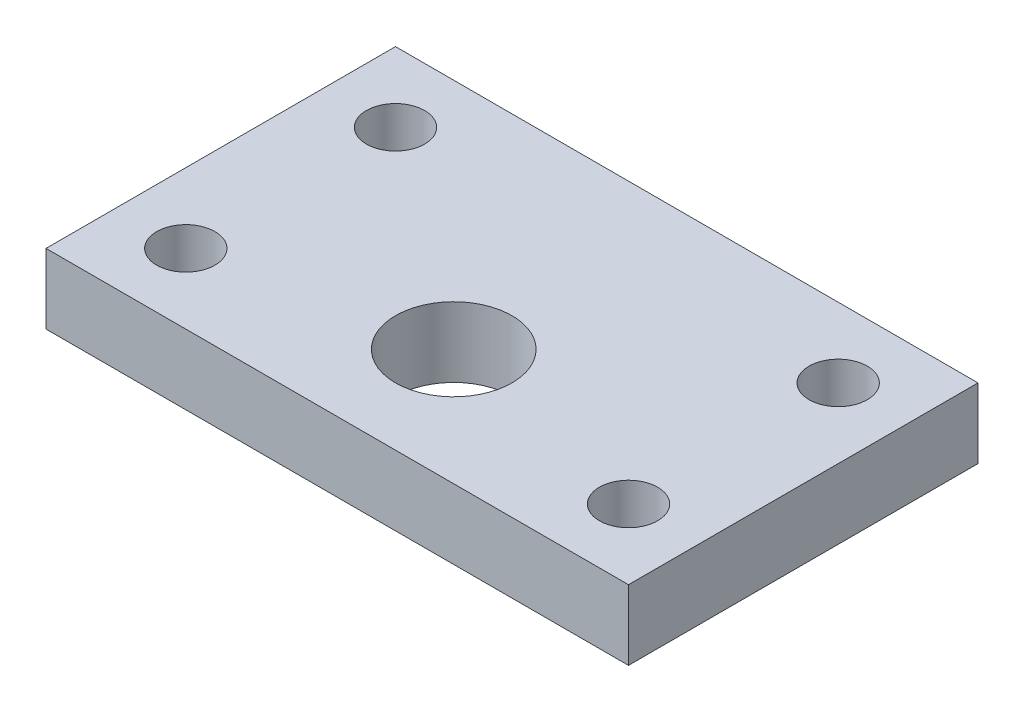
ISO-10303-21;
HEADER;
FILE_DESCRIPTION(('STEP AP214'),'2;1');
FILE_NAME('part.step','',(''),(''),'','','');
FILE_SCHEMA(('AUTOMOTIVE_DESIGN { 1 0 10303 214 1 1 1 1 }'));
ENDSEC;
DATA;
#1=APPLICATION_CONTEXT('core data for automotive mechanical design processes');
#2=APPLICATION_PROTOCOL_DEFINITION('international standard','automotive_design',2000,#1);
#3=PRODUCT_CONTEXT('',#1,'mechanical');
#4=PRODUCT('Part','Part','',(#3));
#5=PRODUCT_RELATED_PRODUCT_CATEGORY('part','',(#4));
#6=PRODUCT_DEFINITION_FORMATION('','',#4);
#7=PRODUCT_DEFINITION_CONTEXT('part definition',#1,'design');
#8=PRODUCT_DEFINITION('design','',#6,#7);
#9=PRODUCT_DEFINITION_SHAPE('','',#8);
#10=(LENGTH_UNIT() NAMED_UNIT(*) SI_UNIT(.MILLI.,.METRE.));
#11=(NAMED_UNIT(*) PLANE_ANGLE_UNIT() SI_UNIT($,.RADIAN.));
#12=(NAMED_UNIT(*) SI_UNIT($,.STERADIAN.) SOLID_ANGLE_UNIT());
#13=UNCERTAINTY_MEASURE_WITH_UNIT(LENGTH_MEASURE(1.E-05),#10,'distance_accuracy_value','');
#14=(GEOMETRIC_REPRESENTATION_CONTEXT(3) GLOBAL_UNCERTAINTY_ASSIGNED_CONTEXT((#13)) GLOBAL_UNIT_ASSIGNED_CONTEXT((#10,
#11,#12)) REPRESENTATION_CONTEXT('',''));
#15=CARTESIAN_POINT('',(0.,0.,0.));
#16=DIRECTION('',(0.,0.,1.));
#17=DIRECTION('',(1.,0.,0.));
#18=AXIS2_PLACEMENT_3D('',#15,#16,#17);
#19=CARTESIAN_POINT('',(0.,30.,0.));
#20=DIRECTION('',(0.,1.,0.));
#21=DIRECTION('',(0.,0.,1.));
#22=AXIS2_PLACEMENT_3D('',#19,#20,#21);
#23=PLANE('',#22);
#24=CARTESIAN_POINT('',(95.,30.,-45.));
#25=DIRECTION('',(0.,1.,0.));
#26=DIRECTION('',(0.,0.,1.));
#27=AXIS2_PLACEMENT_3D('',#24,#25,#26);
#28=CIRCLE('',#27,12.5);
#29=CARTESIAN_POINT('',(95.,30.,-32.5));
#30=VERTEX_POINT('',#29);
#31=EDGE_CURVE('E131',#30,#30,#28,.T.);
#32=ORIENTED_EDGE('',*,*,#31,.F.);
#33=EDGE_LOOP('',(#32));
#34=FACE_BOUND('',#33,.T.);
#35=CARTESIAN_POINT('',(-95.,30.,45.));
#36=DIRECTION('',(0.,1.,0.));
#37=DIRECTION('',(0.,0.,1.));
#38=AXIS2_PLACEMENT_3D('',#35,#36,#37);
#39=CIRCLE('',#38,12.5);
#40=CARTESIAN_POINT('',(-95.,30.,57.5));
#41=VERTEX_POINT('',#40);
#42=EDGE_CURVE('E119',#41,#41,#39,.T.);
#43=ORIENTED_EDGE('',*,*,#42,.F.);
#44=EDGE_LOOP('',(#43));
#45=FACE_BOUND('',#44,.T.);
#46=DIRECTION('',(0.,0.,-1.));
#47=VECTOR('',#46,1.);
#48=CARTESIAN_POINT('',(125.,30.,-75.));
#49=LINE('',#48,#47);
#50=CARTESIAN_POINT('',(125.,30.,75.));
#51=VERTEX_POINT('',#50);
#52=CARTESIAN_POINT('',(125.,30.,-75.));
#53=VERTEX_POINT('',#52);
#54=EDGE_CURVE('E89',#51,#53,#49,.T.);
#55=ORIENTED_EDGE('',*,*,#54,.T.);
#56=DIRECTION('',(-1.,0.,0.));
#57=VECTOR('',#56,1.);
#58=CARTESIAN_POINT('',(-125.,30.,-75.));
#59=LINE('',#58,#57);
#60=CARTESIAN_POINT('',(-125.,30.,-75.));
#61=VERTEX_POINT('',#60);
#62=EDGE_CURVE('E84',#53,#61,#59,.T.);
#63=ORIENTED_EDGE('',*,*,#62,.T.);
#64=DIRECTION('',(0.,0.,1.));
#65=VECTOR('',#64,1.);
#66=CARTESIAN_POINT('',(-125.,30.,-75.));
#67=LINE('',#66,#65);
#68=CARTESIAN_POINT('',(-125.,30.,75.));
#69=VERTEX_POINT('',#68);
#70=EDGE_CURVE('E87',#61,#69,#67,.T.);
#71=ORIENTED_EDGE('',*,*,#70,.T.);
#72=DIRECTION('',(1.,0.,0.));
#73=VECTOR('',#72,1.);
#74=CARTESIAN_POINT('',(-125.,30.,75.));
#75=LINE('',#74,#73);
#76=EDGE_CURVE('E54',#69,#51,#75,.T.);
#77=ORIENTED_EDGE('',*,*,#76,.T.);
#78=EDGE_LOOP('',(#55,#63,#71,#77));
#79=FACE_BOUND('',#78,.T.);
#80=CARTESIAN_POINT('',(0.,30.,25.));
#81=DIRECTION('',(0.,1.,0.));
#82=DIRECTION('',(0.,0.,1.));
#83=AXIS2_PLACEMENT_3D('',#80,#81,#82);
#84=CIRCLE('',#83,25.);
#85=CARTESIAN_POINT('',(0.,30.,50.));
#86=VERTEX_POINT('',#85);
#87=EDGE_CURVE('E104',#86,#86,#84,.T.);
#88=ORIENTED_EDGE('',*,*,#87,.F.);
#89=EDGE_LOOP('',(#88));
#90=FACE_BOUND('',#89,.T.);
#91=CARTESIAN_POINT('',(-95.,30.,-45.));
#92=DIRECTION('',(0.,1.,0.));
#93=DIRECTION('',(0.,0.,1.));
#94=AXIS2_PLACEMENT_3D('',#91,#92,#93);
#95=CIRCLE('',#94,12.5);
#96=CARTESIAN_POINT('',(-95.,30.,-32.5));
#97=VERTEX_POINT('',#96);
#98=EDGE_CURVE('E125',#97,#97,#95,.T.);
#99=ORIENTED_EDGE('',*,*,#98,.F.);
#100=EDGE_LOOP('',(#99));
#101=FACE_BOUND('',#100,.T.);
#102=CARTESIAN_POINT('',(95.,30.,45.));
#103=DIRECTION('',(0.,1.,0.));
#104=DIRECTION('',(0.,0.,1.));
#105=AXIS2_PLACEMENT_3D('',#102,#103,#104);
#106=CIRCLE('',#105,12.5);
#107=CARTESIAN_POINT('',(95.,30.,57.5));
#108=VERTEX_POINT('',#107);
#109=EDGE_CURVE('E137',#108,#108,#106,.T.);
#110=ORIENTED_EDGE('',*,*,#109,.F.);
#111=EDGE_LOOP('',(#110));
#112=FACE_BOUND('',#111,.T.);
#113=ADVANCED_FACE('F37',(#34,#45,#79,#90,#101,#112),#23,.T.);
#114=CARTESIAN_POINT('',(0.,0.,0.));
#115=DIRECTION('',(0.,1.,0.));
#116=DIRECTION('',(0.,0.,1.));
#117=AXIS2_PLACEMENT_3D('',#114,#115,#116);
#118=PLANE('',#117);
#119=DIRECTION('',(0.,0.,-1.));
#120=VECTOR('',#119,1.);
#121=CARTESIAN_POINT('',(125.,0.,-75.));
#122=LINE('',#121,#120);
#123=CARTESIAN_POINT('',(125.,0.,75.));
#124=VERTEX_POINT('',#123);
#125=CARTESIAN_POINT('',(125.,0.,-75.));
#126=VERTEX_POINT('',#125);
#127=EDGE_CURVE('E101',#124,#126,#122,.T.);
#128=ORIENTED_EDGE('',*,*,#127,.F.);
#129=DIRECTION('',(1.,0.,0.));
#130=VECTOR('',#129,1.);
#131=CARTESIAN_POINT('',(-125.,0.,75.));
#132=LINE('',#131,#130);
#133=CARTESIAN_POINT('',(-125.,0.,75.));
#134=VERTEX_POINT('',#133);
#135=EDGE_CURVE('E77',#134,#124,#132,.T.);
#136=ORIENTED_EDGE('',*,*,#135,.F.);
#137=DIRECTION('',(0.,0.,1.));
#138=VECTOR('',#137,1.);
#139=CARTESIAN_POINT('',(-125.,0.,-75.));
#140=LINE('',#139,#138);
#141=CARTESIAN_POINT('',(-125.,0.,-75.));
#142=VERTEX_POINT('',#141);
#143=EDGE_CURVE('E71',#142,#134,#140,.T.);
#144=ORIENTED_EDGE('',*,*,#143,.F.);
#145=DIRECTION('',(-1.,0.,0.));
#146=VECTOR('',#145,1.);
#147=CARTESIAN_POINT('',(-125.,0.,-75.));
#148=LINE('',#147,#146);
#149=EDGE_CURVE('E93',#126,#142,#148,.T.);
#150=ORIENTED_EDGE('',*,*,#149,.F.);
#151=EDGE_LOOP('',(#128,#136,#144,#150));
#152=FACE_BOUND('',#151,.T.);
#153=CARTESIAN_POINT('',(0.,0.,25.));
#154=DIRECTION('',(0.,1.,0.));
#155=DIRECTION('',(0.,0.,1.));
#156=AXIS2_PLACEMENT_3D('',#153,#154,#155);
#157=CIRCLE('',#156,25.);
#158=CARTESIAN_POINT('',(0.,0.,50.));
#159=VERTEX_POINT('',#158);
#160=EDGE_CURVE('E116',#159,#159,#157,.T.);
#161=ORIENTED_EDGE('',*,*,#160,.T.);
#162=EDGE_LOOP('',(#161));
#163=FACE_BOUND('',#162,.T.);
#164=CARTESIAN_POINT('',(-95.,0.,45.));
#165=DIRECTION('',(0.,1.,0.));
#166=DIRECTION('',(0.,0.,1.));
#167=AXIS2_PLACEMENT_3D('',#164,#165,#166);
#168=CIRCLE('',#167,12.5);
#169=CARTESIAN_POINT('',(-95.,0.,57.5));
#170=VERTEX_POINT('',#169);
#171=EDGE_CURVE('E122',#170,#170,#168,.T.);
#172=ORIENTED_EDGE('',*,*,#171,.T.);
#173=EDGE_LOOP('',(#172));
#174=FACE_BOUND('',#173,.T.);
#175=CARTESIAN_POINT('',(-95.,0.,-45.));
#176=DIRECTION('',(0.,1.,0.));
#177=DIRECTION('',(0.,0.,1.));
#178=AXIS2_PLACEMENT_3D('',#175,#176,#177);
#179=CIRCLE('',#178,12.5);
#180=CARTESIAN_POINT('',(-95.,0.,-32.5));
#181=VERTEX_POINT('',#180);
#182=EDGE_CURVE('E128',#181,#181,#179,.T.);
#183=ORIENTED_EDGE('',*,*,#182,.T.);
#184=EDGE_LOOP('',(#183));
#185=FACE_BOUND('',#184,.T.);
#186=CARTESIAN_POINT('',(95.,0.,-45.));
#187=DIRECTION('',(0.,1.,0.));
#188=DIRECTION('',(0.,0.,1.));
#189=AXIS2_PLACEMENT_3D('',#186,#187,#188);
#190=CIRCLE('',#189,12.5);
#191=CARTESIAN_POINT('',(95.,0.,-32.5));
#192=VERTEX_POINT('',#191);
#193=EDGE_CURVE('E134',#192,#192,#190,.T.);
#194=ORIENTED_EDGE('',*,*,#193,.T.);
#195=EDGE_LOOP('',(#194));
#196=FACE_BOUND('',#195,.T.);
#197=CARTESIAN_POINT('',(95.,0.,45.));
#198=DIRECTION('',(0.,1.,0.));
#199=DIRECTION('',(0.,0.,1.));
#200=AXIS2_PLACEMENT_3D('',#197,#198,#199);
#201=CIRCLE('',#200,12.5);
#202=CARTESIAN_POINT('',(95.,0.,57.5));
#203=VERTEX_POINT('',#202);
#204=EDGE_CURVE('E140',#203,#203,#201,.T.);
#205=ORIENTED_EDGE('',*,*,#204,.T.);
#206=EDGE_LOOP('',(#205));
#207=FACE_BOUND('',#206,.T.);
#208=ADVANCED_FACE('F112',(#152,#163,#174,#185,#196,#207),#118,.F.);
#209=CARTESIAN_POINT('',(125.,30.,-75.));
#210=DIRECTION('',(-1.,0.,0.));
#211=DIRECTION('',(0.,0.,1.));
#212=AXIS2_PLACEMENT_3D('',#209,#210,#211);
#213=PLANE('',#212);
#214=ORIENTED_EDGE('',*,*,#127,.T.);
#215=DIRECTION('',(0.,-1.,0.));
#216=VECTOR('',#215,1.);
#217=CARTESIAN_POINT('',(125.,30.,-75.));
#218=LINE('',#217,#216);
#219=EDGE_CURVE('E11',#53,#126,#218,.T.);
#220=ORIENTED_EDGE('',*,*,#219,.F.);
#221=ORIENTED_EDGE('',*,*,#54,.F.);
#222=DIRECTION('',(0.,-1.,0.));
#223=VECTOR('',#222,1.);
#224=CARTESIAN_POINT('',(125.,30.,75.));
#225=LINE('',#224,#223);
#226=EDGE_CURVE('E97',#51,#124,#225,.T.);
#227=ORIENTED_EDGE('',*,*,#226,.T.);
#228=EDGE_LOOP('',(#214,#220,#221,#227));
#229=FACE_BOUND('',#228,.T.);
#230=ADVANCED_FACE('F39',(#229),#213,.F.);
#231=CARTESIAN_POINT('',(-125.,30.,-75.));
#232=DIRECTION('',(0.,0.,1.));
#233=DIRECTION('',(1.,0.,0.));
#234=AXIS2_PLACEMENT_3D('',#231,#232,#233);
#235=PLANE('',#234);
#236=ORIENTED_EDGE('',*,*,#149,.T.);
#237=DIRECTION('',(0.,-1.,0.));
#238=VECTOR('',#237,1.);
#239=CARTESIAN_POINT('',(-125.,30.,-75.));
#240=LINE('',#239,#238);
#241=EDGE_CURVE('E46',#61,#142,#240,.T.);
#242=ORIENTED_EDGE('',*,*,#241,.F.);
#243=ORIENTED_EDGE('',*,*,#62,.F.);
#244=ORIENTED_EDGE('',*,*,#219,.T.);
#245=EDGE_LOOP('',(#236,#242,#243,#244));
#246=FACE_BOUND('',#245,.T.);
#247=ADVANCED_FACE('F92',(#246),#235,.F.);
#248=CARTESIAN_POINT('',(-125.,30.,-75.));
#249=DIRECTION('',(1.,0.,0.));
#250=DIRECTION('',(0.,0.,-1.));
#251=AXIS2_PLACEMENT_3D('',#248,#249,#250);
#252=PLANE('',#251);
#253=ORIENTED_EDGE('',*,*,#143,.T.);
#254=DIRECTION('',(0.,-1.,0.));
#255=VECTOR('',#254,1.);
#256=CARTESIAN_POINT('',(-125.,30.,75.));
#257=LINE('',#256,#255);
#258=EDGE_CURVE('E94',#69,#134,#257,.T.);
#259=ORIENTED_EDGE('',*,*,#258,.F.);
#260=ORIENTED_EDGE('',*,*,#70,.F.);
#261=ORIENTED_EDGE('',*,*,#241,.T.);
#262=EDGE_LOOP('',(#253,#259,#260,#261));
#263=FACE_BOUND('',#262,.T.);
#264=ADVANCED_FACE('F95',(#263),#252,.F.);
#265=CARTESIAN_POINT('',(-125.,30.,75.));
#266=DIRECTION('',(0.,0.,-1.));
#267=DIRECTION('',(-1.,0.,0.));
#268=AXIS2_PLACEMENT_3D('',#265,#266,#267);
#269=PLANE('',#268);
#270=ORIENTED_EDGE('',*,*,#135,.T.);
#271=ORIENTED_EDGE('',*,*,#226,.F.);
#272=ORIENTED_EDGE('',*,*,#76,.F.);
#273=ORIENTED_EDGE('',*,*,#258,.T.);
#274=EDGE_LOOP('',(#270,#271,#272,#273));
#275=FACE_BOUND('',#274,.T.);
#276=ADVANCED_FACE('F109',(#275),#269,.F.);
#277=CARTESIAN_POINT('',(0.,30.,25.));
#278=DIRECTION('',(0.,-1.,0.));
#279=DIRECTION('',(0.,0.,-1.));
#280=AXIS2_PLACEMENT_3D('',#277,#278,#279);
#281=CYLINDRICAL_SURFACE('',#280,25.);
#282=ORIENTED_EDGE('',*,*,#87,.T.);
#283=EDGE_LOOP('',(#282));
#284=FACE_BOUND('',#283,.T.);
#285=ORIENTED_EDGE('',*,*,#160,.F.);
#286=EDGE_LOOP('',(#285));
#287=FACE_BOUND('',#286,.T.);
#288=ADVANCED_FACE('F159',(#284,#287),#281,.F.);
#289=CARTESIAN_POINT('',(-95.,30.,45.));
#290=DIRECTION('',(0.,-1.,0.));
#291=DIRECTION('',(0.,0.,-1.));
#292=AXIS2_PLACEMENT_3D('',#289,#290,#291);
#293=CYLINDRICAL_SURFACE('',#292,12.5);
#294=ORIENTED_EDGE('',*,*,#42,.T.);
#295=EDGE_LOOP('',(#294));
#296=FACE_BOUND('',#295,.T.);
#297=ORIENTED_EDGE('',*,*,#171,.F.);
#298=EDGE_LOOP('',(#297));
#299=FACE_BOUND('',#298,.T.);
#300=ADVANCED_FACE('F213',(#296,#299),#293,.F.);
#301=CARTESIAN_POINT('',(-95.,30.,-45.));
#302=DIRECTION('',(0.,-1.,0.));
#303=DIRECTION('',(0.,0.,-1.));
#304=AXIS2_PLACEMENT_3D('',#301,#302,#303);
#305=CYLINDRICAL_SURFACE('',#304,12.5);
#306=ORIENTED_EDGE('',*,*,#98,.T.);
#307=EDGE_LOOP('',(#306));
#308=FACE_BOUND('',#307,.T.);
#309=ORIENTED_EDGE('',*,*,#182,.F.);
#310=EDGE_LOOP('',(#309));
#311=FACE_BOUND('',#310,.T.);
#312=ADVANCED_FACE('F222',(#308,#311),#305,.F.);
#313=CARTESIAN_POINT('',(95.,30.,-45.));
#314=DIRECTION('',(0.,-1.,0.));
#315=DIRECTION('',(0.,0.,-1.));
#316=AXIS2_PLACEMENT_3D('',#313,#314,#315);
#317=CYLINDRICAL_SURFACE('',#316,12.5);
#318=ORIENTED_EDGE('',*,*,#31,.T.);
#319=EDGE_LOOP('',(#318));
#320=FACE_BOUND('',#319,.T.);
#321=ORIENTED_EDGE('',*,*,#193,.F.);
#322=EDGE_LOOP('',(#321));
#323=FACE_BOUND('',#322,.T.);
#324=ADVANCED_FACE('F231',(#320,#323),#317,.F.);
#325=CARTESIAN_POINT('',(95.,30.,45.));
#326=DIRECTION('',(0.,-1.,0.));
#327=DIRECTION('',(0.,0.,-1.));
#328=AXIS2_PLACEMENT_3D('',#325,#326,#327);
#329=CYLINDRICAL_SURFACE('',#328,12.5);
#330=ORIENTED_EDGE('',*,*,#109,.T.);
#331=EDGE_LOOP('',(#330));
#332=FACE_BOUND('',#331,.T.);
#333=ORIENTED_EDGE('',*,*,#204,.F.);
#334=EDGE_LOOP('',(#333));
#335=FACE_BOUND('',#334,.T.);
#336=ADVANCED_FACE('F146',(#332,#335),#329,.F.);
#337=CLOSED_SHELL('',(#113,#208,#230,#247,#264,#276,#288,#300,#312,#324,#336));
#338=MANIFOLD_SOLID_BREP('B2',#337);
#339=ADVANCED_BREP_SHAPE_REPRESENTATION('',(#18,#338),#14);
#340=SHAPE_DEFINITION_REPRESENTATION(#9,#339);
ENDSEC;
END-ISO-10303-21;
